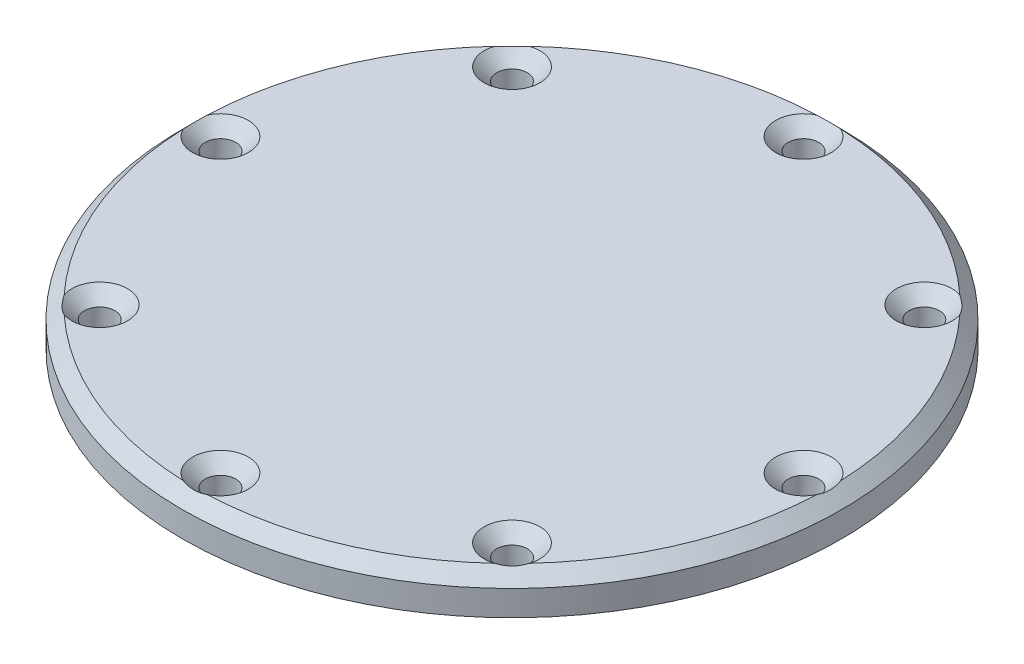
ISO-10303-21;
HEADER;
FILE_DESCRIPTION(('STEP AP214'),'2;1');
FILE_NAME('part.step','',(''),(''),'','','');
FILE_SCHEMA(('AUTOMOTIVE_DESIGN { 1 0 10303 214 1 1 1 1 }'));
ENDSEC;
DATA;
#1=APPLICATION_CONTEXT('core data for automotive mechanical design processes');
#2=APPLICATION_PROTOCOL_DEFINITION('international standard','automotive_design',2000,#1);
#3=PRODUCT_CONTEXT('',#1,'mechanical');
#4=PRODUCT('Part','Part','',(#3));
#5=PRODUCT_RELATED_PRODUCT_CATEGORY('part','',(#4));
#6=PRODUCT_DEFINITION_FORMATION('','',#4);
#7=PRODUCT_DEFINITION_CONTEXT('part definition',#1,'design');
#8=PRODUCT_DEFINITION('design','',#6,#7);
#9=PRODUCT_DEFINITION_SHAPE('','',#8);
#10=(LENGTH_UNIT() NAMED_UNIT(*) SI_UNIT(.MILLI.,.METRE.));
#11=(NAMED_UNIT(*) PLANE_ANGLE_UNIT() SI_UNIT($,.RADIAN.));
#12=(NAMED_UNIT(*) SI_UNIT($,.STERADIAN.) SOLID_ANGLE_UNIT());
#13=UNCERTAINTY_MEASURE_WITH_UNIT(LENGTH_MEASURE(1.E-05),#10,'distance_accuracy_value','');
#14=(GEOMETRIC_REPRESENTATION_CONTEXT(3) GLOBAL_UNCERTAINTY_ASSIGNED_CONTEXT((#13)) GLOBAL_UNIT_ASSIGNED_CONTEXT((#10,
#11,#12)) REPRESENTATION_CONTEXT('',''));
#15=CARTESIAN_POINT('',(0.,0.,0.));
#16=DIRECTION('',(0.,0.,1.));
#17=DIRECTION('',(1.,0.,0.));
#18=AXIS2_PLACEMENT_3D('',#15,#16,#17);
#19=CARTESIAN_POINT('',(0.,0.,0.));
#20=DIRECTION('',(0.,-1.,0.));
#21=DIRECTION('',(0.,0.,-1.));
#22=AXIS2_PLACEMENT_3D('',#19,#20,#21);
#23=PLANE('',#22);
#24=CARTESIAN_POINT('',(0.,-4.25874613352306E-13,-23.));
#25=DIRECTION('',(0.,1.,0.));
#26=DIRECTION('',(0.707106781186549,0.,0.707106781186546));
#27=AXIS2_PLACEMENT_3D('',#24,#25,#26);
#28=CIRCLE('',#27,1.19999999999999);
#29=CARTESIAN_POINT('',(0.848528137423843,-4.25874613352306E-13,-22.1514718625762));
#30=VERTEX_POINT('',#29);
#31=EDGE_CURVE('E108',#30,#30,#28,.T.);
#32=ORIENTED_EDGE('',*,*,#31,.T.);
#33=EDGE_LOOP('',(#32));
#34=FACE_BOUND('',#33,.T.);
#35=CARTESIAN_POINT('',(-16.2634559672906,-4.25874613352306E-13,-16.2634559672906));
#36=DIRECTION('',(0.,1.,0.));
#37=DIRECTION('',(1.,0.,0.));
#38=AXIS2_PLACEMENT_3D('',#35,#36,#37);
#39=CIRCLE('',#38,1.19999999999999);
#40=CARTESIAN_POINT('',(-15.0634559672906,-4.25874613352306E-13,-16.2634559672906));
#41=VERTEX_POINT('',#40);
#42=EDGE_CURVE('E156',#41,#41,#39,.T.);
#43=ORIENTED_EDGE('',*,*,#42,.T.);
#44=EDGE_LOOP('',(#43));
#45=FACE_BOUND('',#44,.T.);
#46=CARTESIAN_POINT('',(-23.,-4.25874613352306E-13,0.));
#47=DIRECTION('',(0.,1.,0.));
#48=DIRECTION('',(0.707106781186544,0.,-0.707106781186551));
#49=AXIS2_PLACEMENT_3D('',#46,#47,#48);
#50=CIRCLE('',#49,1.19999999999999);
#51=CARTESIAN_POINT('',(-22.1514718625762,-4.25874613352306E-13,-0.848528137423765));
#52=VERTEX_POINT('',#51);
#53=EDGE_CURVE('E170',#52,#52,#50,.T.);
#54=ORIENTED_EDGE('',*,*,#53,.T.);
#55=EDGE_LOOP('',(#54));
#56=FACE_BOUND('',#55,.T.);
#57=CARTESIAN_POINT('',(-16.2634559672906,-4.25874613352306E-13,16.2634559672906));
#58=DIRECTION('',(0.,1.,0.));
#59=DIRECTION('',(0.,0.,-1.));
#60=AXIS2_PLACEMENT_3D('',#57,#58,#59);
#61=CIRCLE('',#60,1.19999999999999);
#62=CARTESIAN_POINT('',(-16.2634559672906,-4.25874613352306E-13,15.0634559672906));
#63=VERTEX_POINT('',#62);
#64=EDGE_CURVE('E212',#63,#63,#61,.T.);
#65=ORIENTED_EDGE('',*,*,#64,.T.);
#66=EDGE_LOOP('',(#65));
#67=FACE_BOUND('',#66,.T.);
#68=CARTESIAN_POINT('',(1.66533453693773E-13,-4.25874613352306E-13,23.));
#69=DIRECTION('',(0.,1.,0.));
#70=DIRECTION('',(-0.707106781186554,0.,-0.707106781186541));
#71=AXIS2_PLACEMENT_3D('',#68,#69,#70);
#72=CIRCLE('',#71,1.19999999999999);
#73=CARTESIAN_POINT('',(-0.848528137423688,-4.25874613352306E-13,22.1514718625762));
#74=VERTEX_POINT('',#73);
#75=EDGE_CURVE('E216',#74,#74,#72,.T.);
#76=ORIENTED_EDGE('',*,*,#75,.T.);
#77=EDGE_LOOP('',(#76));
#78=FACE_BOUND('',#77,.T.);
#79=CARTESIAN_POINT('',(16.2634559672907,-4.25874613352306E-13,16.2634559672904));
#80=DIRECTION('',(0.,1.,0.));
#81=DIRECTION('',(-1.,0.,0.));
#82=AXIS2_PLACEMENT_3D('',#79,#80,#81);
#83=CIRCLE('',#82,1.19999999999999);
#84=CARTESIAN_POINT('',(15.0634559672907,-4.25874613352306E-13,16.2634559672905));
#85=VERTEX_POINT('',#84);
#86=EDGE_CURVE('E220',#85,#85,#83,.T.);
#87=ORIENTED_EDGE('',*,*,#86,.T.);
#88=EDGE_LOOP('',(#87));
#89=FACE_BOUND('',#88,.T.);
#90=CARTESIAN_POINT('',(23.,-4.25874613352306E-13,-2.46330733588707E-13));
#91=DIRECTION('',(0.,1.,0.));
#92=DIRECTION('',(-0.707106781186539,0.,0.707106781186556));
#93=AXIS2_PLACEMENT_3D('',#90,#91,#92);
#94=CIRCLE('',#93,1.19999999999999);
#95=CARTESIAN_POINT('',(22.1514718625762,-4.25874613352306E-13,0.848528137423611));
#96=VERTEX_POINT('',#95);
#97=EDGE_CURVE('E224',#96,#96,#94,.T.);
#98=ORIENTED_EDGE('',*,*,#97,.T.);
#99=EDGE_LOOP('',(#98));
#100=FACE_BOUND('',#99,.T.);
#101=CARTESIAN_POINT('',(16.2634559672906,-4.25874613352306E-13,-16.2634559672906));
#102=DIRECTION('',(0.,1.,0.));
#103=DIRECTION('',(0.,0.,1.));
#104=AXIS2_PLACEMENT_3D('',#101,#102,#103);
#105=CIRCLE('',#104,1.19999999999999);
#106=CARTESIAN_POINT('',(16.2634559672906,-4.25874613352306E-13,-15.0634559672906));
#107=VERTEX_POINT('',#106);
#108=EDGE_CURVE('E122',#107,#107,#105,.T.);
#109=ORIENTED_EDGE('',*,*,#108,.T.);
#110=EDGE_LOOP('',(#109));
#111=FACE_BOUND('',#110,.T.);
#112=CARTESIAN_POINT('',(0.,0.,0.));
#113=DIRECTION('',(0.,-1.,0.));
#114=DIRECTION('',(0.,0.,-1.));
#115=AXIS2_PLACEMENT_3D('',#112,#113,#114);
#116=CIRCLE('',#115,26.);
#117=CARTESIAN_POINT('',(0.,0.,-26.));
#118=VERTEX_POINT('',#117);
#119=EDGE_CURVE('E46',#118,#118,#116,.T.);
#120=ORIENTED_EDGE('',*,*,#119,.T.);
#121=EDGE_LOOP('',(#120));
#122=FACE_BOUND('',#121,.T.);
#123=ADVANCED_FACE('F34',(#34,#45,#56,#67,#78,#89,#100,#111,#122),#23,.T.);
#124=CARTESIAN_POINT('',(0.,0.,0.));
#125=DIRECTION('',(0.,-1.,0.));
#126=DIRECTION('',(0.,0.,-1.));
#127=AXIS2_PLACEMENT_3D('',#124,#125,#126);
#128=CYLINDRICAL_SURFACE('',#127,26.);
#129=CARTESIAN_POINT('',(0.,2.,0.));
#130=DIRECTION('',(0.,-1.,0.));
#131=DIRECTION('',(0.,0.,-1.));
#132=AXIS2_PLACEMENT_3D('',#129,#130,#131);
#133=CIRCLE('',#132,26.);
#134=CARTESIAN_POINT('',(0.,2.,-26.));
#135=VERTEX_POINT('',#134);
#136=EDGE_CURVE('E131',#135,#135,#133,.T.);
#137=ORIENTED_EDGE('',*,*,#136,.T.);
#138=EDGE_LOOP('',(#137));
#139=FACE_BOUND('',#138,.T.);
#140=ORIENTED_EDGE('',*,*,#119,.F.);
#141=EDGE_LOOP('',(#140));
#142=FACE_BOUND('',#141,.T.);
#143=ADVANCED_FACE('F196',(#139,#142),#128,.T.);
#144=CARTESIAN_POINT('',(0.,2.,0.));
#145=DIRECTION('',(0.,-1.,0.));
#146=DIRECTION('',(0.,0.,-1.));
#147=AXIS2_PLACEMENT_3D('',#144,#145,#146);
#148=CONICAL_SURFACE('',#147,26.,0.785398163397447);
#149=CARTESIAN_POINT('',(0.956309286648669,3.00019999999958,-24.9815026086961));
#150=CARTESIAN_POINT('',(0.87103099326336,2.98223050739615,-25.0027534869278));
#151=CARTESIAN_POINT('',(0.784586897043976,2.96649907890229,-25.0213576110847));
#152=CARTESIAN_POINT('',(0.609894930945489,2.93981124019831,-25.0529188812349));
#153=CARTESIAN_POINT('',(0.521645945818552,2.92885788179651,-25.0658724181331));
#154=CARTESIAN_POINT('',(0.346418157432572,2.91227924219472,-25.0854784614556));
#155=CARTESIAN_POINT('',(0.259470879918621,2.90651609574551,-25.0922940085237));
#156=CARTESIAN_POINT('',(0.085161055164271,2.89996303913165,-25.1000437102313));
#157=CARTESIAN_POINT('',(-0.00220128685794571,2.89917088473064,-25.1009805189243));
#158=CARTESIAN_POINT('',(-0.162175447605604,2.90229155461146,-25.0972899875923));
#159=CARTESIAN_POINT('',(-0.234825470343622,2.90544423923967,-25.0935615953339));
#160=CARTESIAN_POINT('',(-0.379578625365488,2.91515482823399,-25.0820777683496));
#161=CARTESIAN_POINT('',(-0.45168175624664,2.92171274133103,-25.0743223232985));
#162=CARTESIAN_POINT('',(-0.596669220070628,2.93831116439749,-25.0546928838503));
#163=CARTESIAN_POINT('',(-0.66953185742234,2.94843017895848,-25.0427260492405));
#164=CARTESIAN_POINT('',(-0.813963079091291,2.97192221420962,-25.014944164073));
#165=CARTESIAN_POINT('',(-0.885532109500487,2.98529408925064,-24.99913046837));
#166=CARTESIAN_POINT('',(-0.956309286648681,3.00019999999958,-24.9815026086961));
#167=B_SPLINE_CURVE_WITH_KNOTS('',3,(#149,#150,#151,#152,#153,#154,#155,#156,#157,#158,#159,
#160,#161,#162,#163,#164,#165,#166),.UNSPECIFIED.,.F.,.F.,(4,2,2,2,2,2,2,2,4),(0.,
0.269090275247971,0.538352170789932,0.800230636032514,1.06199086341166,1.28024339197641,
1.49849648013749,1.72189812645513,1.9452212049131),.UNSPECIFIED.);
#168=CARTESIAN_POINT('',(0.955358581321902,3.,-24.9817391304348));
#169=VERTEX_POINT('',#168);
#170=CARTESIAN_POINT('',(-0.955358581320986,2.99999999999954,-24.9817391304348));
#171=VERTEX_POINT('',#170);
#172=EDGE_CURVE('E52',#169,#171,#167,.T.);
#173=ORIENTED_EDGE('',*,*,#172,.F.);
#174=CARTESIAN_POINT('',(0.,3.,0.));
#175=DIRECTION('',(0.,-1.,0.));
#176=DIRECTION('',(0.,0.,-1.));
#177=AXIS2_PLACEMENT_3D('',#174,#175,#176);
#178=CIRCLE('',#177,25.);
#179=CARTESIAN_POINT('',(16.989216613648,2.99999999999958,-18.3402976762802));
#180=VERTEX_POINT('',#179);
#181=EDGE_CURVE('E114',#169,#180,#178,.T.);
#182=ORIENTED_EDGE('',*,*,#181,.T.);
#183=CARTESIAN_POINT('',(18.3408026803394,3.00019999999958,-16.9883771173375));
#184=CARTESIAN_POINT('',(18.2955284609024,2.98223050739615,-17.063704616982));
#185=CARTESIAN_POINT('',(18.2475583566216,2.96649907890229,-17.1379849259617));
#186=CARTESIAN_POINT('',(18.1463496709206,2.93981124019832,-17.2838279879548));
#187=CARTESIAN_POINT('',(18.0931077488856,2.92885788179651,-17.355388977552));
#188=CARTESIAN_POINT('',(17.9830665576511,2.91227924219472,-17.4931573011576));
#189=CARTESIAN_POINT('',(17.9264048676646,2.90651609574551,-17.5594576302427));
#190=CARTESIAN_POINT('',(17.808629075183,2.89996303913165,-17.6881931559836));
#191=CARTESIAN_POINT('',(17.7475169944982,2.89917088473064,-17.7506300842273));
#192=CARTESIAN_POINT('',(17.6317885808879,2.90229155461146,-17.8611392983756));
#193=CARTESIAN_POINT('',(17.5777808857076,2.90544423923967,-17.9098742506582));
#194=CARTESIAN_POINT('',(17.467304656259,2.915154828234,-18.0041098962377));
#195=CARTESIAN_POINT('',(17.4108361156814,2.92171274133103,-18.0496105812418));
#196=CARTESIAN_POINT('',(17.2944343870797,2.93831116439749,-18.1382520903541));
#197=CARTESIAN_POINT('',(17.2344508922112,2.94843017895848,-18.1813119254187));
#198=CARTESIAN_POINT('',(17.112677836558,2.97192221420962,-18.2637954622798));
#199=CARTESIAN_POINT('',(17.0508889183654,2.98529408925064,-18.3032204375378));
#200=CARTESIAN_POINT('',(16.9883771173375,3.00019999999958,-18.3408026803394));
#201=B_SPLINE_CURVE_WITH_KNOTS('',3,(#183,#184,#185,#186,#187,#188,#189,#190,#191,#192,#193,
#194,#195,#196,#197,#198,#199,#200),.UNSPECIFIED.,.F.,.F.,(4,2,2,2,2,2,2,2,4),(0.,
0.26909027524797,0.538352170789932,0.800230636032514,1.06199086341165,1.28024339197641,
1.49849648013749,1.72189812645513,1.9452212049131),.UNSPECIFIED.);
#202=CARTESIAN_POINT('',(18.3402976762812,3.,-16.9892166136462));
#203=VERTEX_POINT('',#202);
#204=EDGE_CURVE('E11',#203,#180,#201,.T.);
#205=ORIENTED_EDGE('',*,*,#204,.F.);
#206=CARTESIAN_POINT('',(24.9817391304348,2.99999999999954,-0.955358581321248));
#207=VERTEX_POINT('',#206);
#208=EDGE_CURVE('E124',#203,#207,#178,.T.);
#209=ORIENTED_EDGE('',*,*,#208,.T.);
#210=CARTESIAN_POINT('',(24.9815026086961,3.00019999999958,0.956309286648407));
#211=CARTESIAN_POINT('',(25.0027534869278,2.98223050739615,0.871030993263098));
#212=CARTESIAN_POINT('',(25.0213576110847,2.96649907890229,0.784586897043713));
#213=CARTESIAN_POINT('',(25.0529188812349,2.93981124019831,0.609894930945227));
#214=CARTESIAN_POINT('',(25.0658724181331,2.92885788179651,0.521645945818289));
#215=CARTESIAN_POINT('',(25.0854784614556,2.91227924219472,0.346418157432309));
#216=CARTESIAN_POINT('',(25.0922940085237,2.90651609574551,0.259470879918358));
#217=CARTESIAN_POINT('',(25.1000437102313,2.89996303913164,0.0851610551640076));
#218=CARTESIAN_POINT('',(25.1009805189243,2.89917088473064,-0.00220128685820928));
#219=CARTESIAN_POINT('',(25.0972899875923,2.90229155461147,-0.162175447605867));
#220=CARTESIAN_POINT('',(25.0935615953339,2.90544423923967,-0.234825470343885));
#221=CARTESIAN_POINT('',(25.0820777683496,2.915154828234,-0.379578625365751));
#222=CARTESIAN_POINT('',(25.0743223232985,2.92171274133103,-0.451681756246903));
#223=CARTESIAN_POINT('',(25.0546928838503,2.93831116439749,-0.59666922007089));
#224=CARTESIAN_POINT('',(25.0427260492405,2.94843017895848,-0.669531857422603));
#225=CARTESIAN_POINT('',(25.014944164073,2.97192221420962,-0.813963079091553));
#226=CARTESIAN_POINT('',(24.9991304683699,2.98529408925064,-0.885532109500748));
#227=CARTESIAN_POINT('',(24.9815026086961,3.00019999999958,-0.956309286648941));
#228=B_SPLINE_CURVE_WITH_KNOTS('',3,(#210,#211,#212,#213,#214,#215,#216,#217,#218,#219,#220,
#221,#222,#223,#224,#225,#226,#227),.UNSPECIFIED.,.F.,.F.,(4,2,2,2,2,2,2,2,4),(0.,
0.269090275247972,0.538352170789932,0.800230636032514,1.06199086341166,1.28024339197641,
1.49849648013749,1.72189812645513,1.9452212049131),.UNSPECIFIED.);
#229=CARTESIAN_POINT('',(24.9817391304348,3.,0.95535858132164));
#230=VERTEX_POINT('',#229);
#231=EDGE_CURVE('E249',#230,#207,#228,.T.);
#232=ORIENTED_EDGE('',*,*,#231,.F.);
#233=CARTESIAN_POINT('',(18.3402976762807,2.99999999999954,16.9892166136468));
#234=VERTEX_POINT('',#233);
#235=EDGE_CURVE('E132',#230,#234,#178,.T.);
#236=ORIENTED_EDGE('',*,*,#235,.T.);
#237=CARTESIAN_POINT('',(16.9883771173377,3.00019999999958,18.3408026803392));
#238=CARTESIAN_POINT('',(17.0637046169822,2.98223050739615,18.2955284609022));
#239=CARTESIAN_POINT('',(17.1379849259619,2.96649907890229,18.2475583566214));
#240=CARTESIAN_POINT('',(17.283827987955,2.93981124019831,18.1463496709204));
#241=CARTESIAN_POINT('',(17.3553889775521,2.92885788179651,18.0931077488854));
#242=CARTESIAN_POINT('',(17.4931573011578,2.91227924219472,17.9830665576509));
#243=CARTESIAN_POINT('',(17.5594576302429,2.90651609574551,17.9264048676644));
#244=CARTESIAN_POINT('',(17.6881931559838,2.89996303913165,17.8086290751828));
#245=CARTESIAN_POINT('',(17.7506300842275,2.89917088473064,17.747516994498));
#246=CARTESIAN_POINT('',(17.8611392983758,2.90229155461146,17.6317885808877));
#247=CARTESIAN_POINT('',(17.9098742506584,2.90544423923967,17.5777808857075));
#248=CARTESIAN_POINT('',(18.0041098962379,2.915154828234,17.4673046562588));
#249=CARTESIAN_POINT('',(18.049610581242,2.92171274133103,17.4108361156812));
#250=CARTESIAN_POINT('',(18.1382520903543,2.93831116439749,17.2944343870795));
#251=CARTESIAN_POINT('',(18.1813119254189,2.94843017895848,17.234450892211));
#252=CARTESIAN_POINT('',(18.26379546228,2.97192221420962,17.1126778365578));
#253=CARTESIAN_POINT('',(18.303220437538,2.98529408925064,17.0508889183652));
#254=CARTESIAN_POINT('',(18.3408026803396,3.00019999999958,16.9883771173373));
#255=B_SPLINE_CURVE_WITH_KNOTS('',3,(#237,#238,#239,#240,#241,#242,#243,#244,#245,#246,#247,
#248,#249,#250,#251,#252,#253,#254),.UNSPECIFIED.,.F.,.F.,(4,2,2,2,2,2,2,2,4),(0.,
0.26909027524797,0.538352170789931,0.800230636032515,1.06199086341166,1.28024339197641,
1.4984964801375,1.72189812645513,1.9452212049131),.UNSPECIFIED.);
#256=CARTESIAN_POINT('',(16.9892166136464,3.,18.3402976762811));
#257=VERTEX_POINT('',#256);
#258=EDGE_CURVE('E245',#257,#234,#255,.T.);
#259=ORIENTED_EDGE('',*,*,#258,.F.);
#260=CARTESIAN_POINT('',(0.955358581321162,2.99999999999954,24.9817391304348));
#261=VERTEX_POINT('',#260);
#262=EDGE_CURVE('E136',#257,#261,#178,.T.);
#263=ORIENTED_EDGE('',*,*,#262,.T.);
#264=CARTESIAN_POINT('',(-0.956309286648494,3.00019999999958,24.9815026086961));
#265=CARTESIAN_POINT('',(-0.871030993263185,2.98223050739615,25.0027534869278));
#266=CARTESIAN_POINT('',(-0.7845868970438,2.96649907890229,25.0213576110847));
#267=CARTESIAN_POINT('',(-0.609894930945313,2.93981124019831,25.0529188812349));
#268=CARTESIAN_POINT('',(-0.521645945818376,2.92885788179651,25.0658724181331));
#269=CARTESIAN_POINT('',(-0.346418157432396,2.91227924219472,25.0854784614556));
#270=CARTESIAN_POINT('',(-0.259470879918445,2.90651609574551,25.0922940085237));
#271=CARTESIAN_POINT('',(-0.0851610551640943,2.89996303913165,25.1000437102313));
#272=CARTESIAN_POINT('',(0.00220128685812254,2.89917088473064,25.1009805189243));
#273=CARTESIAN_POINT('',(0.162175447605781,2.90229155461146,25.0972899875923));
#274=CARTESIAN_POINT('',(0.234825470343798,2.90544423923967,25.0935615953339));
#275=CARTESIAN_POINT('',(0.379578625365665,2.91515482823399,25.0820777683496));
#276=CARTESIAN_POINT('',(0.451681756246816,2.92171274133103,25.0743223232985));
#277=CARTESIAN_POINT('',(0.596669220070803,2.93831116439749,25.0546928838503));
#278=CARTESIAN_POINT('',(0.669531857422516,2.94843017895848,25.0427260492405));
#279=CARTESIAN_POINT('',(0.813963079091466,2.97192221420962,25.014944164073));
#280=CARTESIAN_POINT('',(0.885532109500661,2.98529408925064,24.9991304683699));
#281=CARTESIAN_POINT('',(0.956309286648855,3.00019999999958,24.9815026086961));
#282=B_SPLINE_CURVE_WITH_KNOTS('',3,(#264,#265,#266,#267,#268,#269,#270,#271,#272,#273,#274,
#275,#276,#277,#278,#279,#280,#281),.UNSPECIFIED.,.F.,.F.,(4,2,2,2,2,2,2,2,4),(0.,
0.269090275247972,0.538352170789933,0.800230636032515,1.06199086341166,1.28024339197641,
1.49849648013749,1.72189812645513,1.9452212049131),.UNSPECIFIED.);
#283=CARTESIAN_POINT('',(-0.955358581321727,3.,24.9817391304348));
#284=VERTEX_POINT('',#283);
#285=EDGE_CURVE('E451',#284,#261,#282,.T.);
#286=ORIENTED_EDGE('',*,*,#285,.F.);
#287=CARTESIAN_POINT('',(-16.989216613647,2.99999999999954,18.3402976762806));
#288=VERTEX_POINT('',#287);
#289=EDGE_CURVE('E140',#284,#288,#178,.T.);
#290=ORIENTED_EDGE('',*,*,#289,.T.);
#291=CARTESIAN_POINT('',(-18.3408026803394,3.00019999999958,16.9883771173375));
#292=CARTESIAN_POINT('',(-18.2955284609024,2.98223050739615,17.063704616982));
#293=CARTESIAN_POINT('',(-18.2475583566216,2.96649907890229,17.1379849259617));
#294=CARTESIAN_POINT('',(-18.1463496709206,2.93981124019832,17.2838279879548));
#295=CARTESIAN_POINT('',(-18.0931077488856,2.92885788179651,17.355388977552));
#296=CARTESIAN_POINT('',(-17.9830665576511,2.91227924219472,17.4931573011576));
#297=CARTESIAN_POINT('',(-17.9264048676646,2.90651609574551,17.5594576302427));
#298=CARTESIAN_POINT('',(-17.808629075183,2.89996303913165,17.6881931559836));
#299=CARTESIAN_POINT('',(-17.7475169944982,2.89917088473064,17.7506300842273));
#300=CARTESIAN_POINT('',(-17.6317885808879,2.90229155461146,17.8611392983756));
#301=CARTESIAN_POINT('',(-17.5777808857076,2.90544423923967,17.9098742506582));
#302=CARTESIAN_POINT('',(-17.467304656259,2.915154828234,18.0041098962377));
#303=CARTESIAN_POINT('',(-17.4108361156814,2.92171274133103,18.0496105812418));
#304=CARTESIAN_POINT('',(-17.2944343870797,2.93831116439749,18.1382520903541));
#305=CARTESIAN_POINT('',(-17.2344508922112,2.94843017895848,18.1813119254187));
#306=CARTESIAN_POINT('',(-17.112677836558,2.97192221420962,18.2637954622798));
#307=CARTESIAN_POINT('',(-17.0508889183654,2.98529408925064,18.3032204375378));
#308=CARTESIAN_POINT('',(-16.9883771173375,3.00019999999958,18.3408026803394));
#309=B_SPLINE_CURVE_WITH_KNOTS('',3,(#291,#292,#293,#294,#295,#296,#297,#298,#299,#300,#301,
#302,#303,#304,#305,#306,#307,#308),.UNSPECIFIED.,.F.,.F.,(4,2,2,2,2,2,2,2,4),(0.,
0.26909027524797,0.538352170789932,0.800230636032514,1.06199086341165,1.28024339197641,
1.49849648013749,1.72189812645513,1.9452212049131),.UNSPECIFIED.);
#310=CARTESIAN_POINT('',(-18.3402976762812,3.,16.9892166136462));
#311=VERTEX_POINT('',#310);
#312=EDGE_CURVE('E438',#311,#288,#309,.T.);
#313=ORIENTED_EDGE('',*,*,#312,.F.);
#314=CARTESIAN_POINT('',(-24.9817391304348,2.99999999999954,0.955358581321075));
#315=VERTEX_POINT('',#314);
#316=EDGE_CURVE('E144',#311,#315,#178,.T.);
#317=ORIENTED_EDGE('',*,*,#316,.T.);
#318=CARTESIAN_POINT('',(-24.9815026086961,3.00019999999958,-0.956309286648581));
#319=CARTESIAN_POINT('',(-25.0027534869278,2.98223050739615,-0.871030993263272));
#320=CARTESIAN_POINT('',(-25.0213576110847,2.96649907890229,-0.784586897043887));
#321=CARTESIAN_POINT('',(-25.0529188812349,2.93981124019832,-0.6098949309454));
#322=CARTESIAN_POINT('',(-25.0658724181331,2.92885788179651,-0.521645945818462));
#323=CARTESIAN_POINT('',(-25.0854784614556,2.91227924219472,-0.346418157432482));
#324=CARTESIAN_POINT('',(-25.0922940085237,2.90651609574551,-0.259470879918531));
#325=CARTESIAN_POINT('',(-25.1000437102313,2.89996303913165,-0.0851610551641808));
#326=CARTESIAN_POINT('',(-25.1009805189243,2.89917088473064,0.00220128685803598));
#327=CARTESIAN_POINT('',(-25.0972899875923,2.90229155461146,0.162175447605694));
#328=CARTESIAN_POINT('',(-25.0935615953339,2.90544423923967,0.234825470343711));
#329=CARTESIAN_POINT('',(-25.0820777683496,2.915154828234,0.379578625365578));
#330=CARTESIAN_POINT('',(-25.0743223232985,2.92171274133103,0.451681756246729));
#331=CARTESIAN_POINT('',(-25.0546928838503,2.93831116439749,0.596669220070717));
#332=CARTESIAN_POINT('',(-25.0427260492405,2.94843017895849,0.66953185742243));
#333=CARTESIAN_POINT('',(-25.014944164073,2.97192221420962,0.813963079091381));
#334=CARTESIAN_POINT('',(-24.9991304683699,2.98529408925064,0.885532109500576));
#335=CARTESIAN_POINT('',(-24.9815026086961,3.00019999999958,0.95630928664877));
#336=B_SPLINE_CURVE_WITH_KNOTS('',3,(#318,#319,#320,#321,#322,#323,#324,#325,#326,#327,#328,
#329,#330,#331,#332,#333,#334,#335),.UNSPECIFIED.,.F.,.F.,(4,2,2,2,2,2,2,2,4),(0.,
0.269090275247972,0.538352170789933,0.800230636032515,1.06199086341166,1.28024339197641,
1.49849648013749,1.72189812645513,1.9452212049131),.UNSPECIFIED.);
#337=CARTESIAN_POINT('',(-24.9817391304348,3.,-0.955358581321814));
#338=VERTEX_POINT('',#337);
#339=EDGE_CURVE('E152',#338,#315,#336,.T.);
#340=ORIENTED_EDGE('',*,*,#339,.F.);
#341=CARTESIAN_POINT('',(-18.3402976762806,2.99999999999954,-16.9892166136469));
#342=VERTEX_POINT('',#341);
#343=EDGE_CURVE('E125',#338,#342,#178,.T.);
#344=ORIENTED_EDGE('',*,*,#343,.T.);
#345=CARTESIAN_POINT('',(-16.9883771173375,3.00019999999958,-18.3408026803394));
#346=CARTESIAN_POINT('',(-17.0637046169821,2.98223050739615,-18.2955284609024));
#347=CARTESIAN_POINT('',(-17.1379849259617,2.96649907890229,-18.2475583566215));
#348=CARTESIAN_POINT('',(-17.2838279879549,2.93981124019831,-18.1463496709205));
#349=CARTESIAN_POINT('',(-17.355388977552,2.92885788179651,-18.0931077488855));
#350=CARTESIAN_POINT('',(-17.4931573011577,2.91227924219472,-17.983066557651));
#351=CARTESIAN_POINT('',(-17.5594576302428,2.90651609574551,-17.9264048676645));
#352=CARTESIAN_POINT('',(-17.6881931559837,2.89996303913165,-17.8086290751829));
#353=CARTESIAN_POINT('',(-17.7506300842274,2.89917088473064,-17.7475169944982));
#354=CARTESIAN_POINT('',(-17.8611392983757,2.90229155461146,-17.6317885808879));
#355=CARTESIAN_POINT('',(-17.9098742506582,2.90544423923967,-17.5777808857076));
#356=CARTESIAN_POINT('',(-18.0041098962378,2.915154828234,-17.4673046562589));
#357=CARTESIAN_POINT('',(-18.0496105812419,2.92171274133103,-17.4108361156813));
#358=CARTESIAN_POINT('',(-18.1382520903541,2.93831116439749,-17.2944343870796));
#359=CARTESIAN_POINT('',(-18.1813119254188,2.94843017895849,-17.2344508922112));
#360=CARTESIAN_POINT('',(-18.2637954622799,2.97192221420962,-17.1126778365579));
#361=CARTESIAN_POINT('',(-18.3032204375379,2.98529408925064,-17.0508889183654));
#362=CARTESIAN_POINT('',(-18.3408026803394,3.00019999999958,-16.9883771173375));
#363=B_SPLINE_CURVE_WITH_KNOTS('',3,(#345,#346,#347,#348,#349,#350,#351,#352,#353,#354,#355,
#356,#357,#358,#359,#360,#361,#362),.UNSPECIFIED.,.F.,.F.,(4,2,2,2,2,2,2,2,4),(0.,
0.269090275247973,0.538352170789935,0.800230636032516,1.06199086341166,1.28024339197641,
1.4984964801375,1.72189812645513,1.9452212049131),.UNSPECIFIED.);
#364=CARTESIAN_POINT('',(-16.9892166136463,3.,-18.3402976762812));
#365=VERTEX_POINT('',#364);
#366=EDGE_CURVE('E59',#365,#342,#363,.T.);
#367=ORIENTED_EDGE('',*,*,#366,.F.);
#368=EDGE_CURVE('E115',#365,#171,#178,.T.);
#369=ORIENTED_EDGE('',*,*,#368,.T.);
#370=EDGE_LOOP('',(#173,#182,#205,#209,#232,#236,#259,#263,#286,#290,#313,#317,#340,#344,#367,#369));
#371=FACE_BOUND('',#370,.T.);
#372=ORIENTED_EDGE('',*,*,#136,.F.);
#373=EDGE_LOOP('',(#372));
#374=FACE_BOUND('',#373,.T.);
#375=ADVANCED_FACE('F111',(#371,#374),#148,.T.);
#376=CARTESIAN_POINT('',(25.,2.99999999999958,0.));
#377=DIRECTION('',(0.,1.,0.));
#378=DIRECTION('',(0.,0.,1.));
#379=AXIS2_PLACEMENT_3D('',#376,#377,#378);
#380=PLANE('',#379);
#381=CARTESIAN_POINT('',(0.,2.99999999999958,-23.));
#382=DIRECTION('',(0.,1.,0.));
#383=DIRECTION('',(0.707106781186549,0.,0.707106781186546));
#384=AXIS2_PLACEMENT_3D('',#381,#382,#383);
#385=CIRCLE('',#384,2.2);
#386=EDGE_CURVE('E100',#171,#169,#385,.T.);
#387=ORIENTED_EDGE('',*,*,#386,.F.);
#388=ORIENTED_EDGE('',*,*,#368,.F.);
#389=CARTESIAN_POINT('',(-16.2634559672906,2.99999999999958,-16.2634559672906));
#390=DIRECTION('',(0.,1.,0.));
#391=DIRECTION('',(1.,0.,0.));
#392=AXIS2_PLACEMENT_3D('',#389,#390,#391);
#393=CIRCLE('',#392,2.2);
#394=EDGE_CURVE('E155',#342,#365,#393,.T.);
#395=ORIENTED_EDGE('',*,*,#394,.F.);
#396=ORIENTED_EDGE('',*,*,#343,.F.);
#397=CARTESIAN_POINT('',(-23.,2.99999999999958,0.));
#398=DIRECTION('',(0.,1.,0.));
#399=DIRECTION('',(0.707106781186544,0.,-0.707106781186551));
#400=AXIS2_PLACEMENT_3D('',#397,#398,#399);
#401=CIRCLE('',#400,2.2);
#402=EDGE_CURVE('E154',#315,#338,#401,.T.);
#403=ORIENTED_EDGE('',*,*,#402,.F.);
#404=ORIENTED_EDGE('',*,*,#316,.F.);
#405=CARTESIAN_POINT('',(-16.2634559672906,2.99999999999958,16.2634559672906));
#406=DIRECTION('',(0.,1.,0.));
#407=DIRECTION('',(0.,0.,-1.));
#408=AXIS2_PLACEMENT_3D('',#405,#406,#407);
#409=CIRCLE('',#408,2.2);
#410=EDGE_CURVE('E479',#288,#311,#409,.T.);
#411=ORIENTED_EDGE('',*,*,#410,.F.);
#412=ORIENTED_EDGE('',*,*,#289,.F.);
#413=CARTESIAN_POINT('',(1.66533453693773E-13,2.99999999999958,23.));
#414=DIRECTION('',(0.,1.,0.));
#415=DIRECTION('',(-0.707106781186554,0.,-0.707106781186541));
#416=AXIS2_PLACEMENT_3D('',#413,#414,#415);
#417=CIRCLE('',#416,2.2);
#418=EDGE_CURVE('E473',#261,#284,#417,.T.);
#419=ORIENTED_EDGE('',*,*,#418,.F.);
#420=ORIENTED_EDGE('',*,*,#262,.F.);
#421=CARTESIAN_POINT('',(16.2634559672907,2.99999999999958,16.2634559672904));
#422=DIRECTION('',(0.,1.,0.));
#423=DIRECTION('',(-1.,0.,0.));
#424=AXIS2_PLACEMENT_3D('',#421,#422,#423);
#425=CIRCLE('',#424,2.2);
#426=EDGE_CURVE('E466',#234,#257,#425,.T.);
#427=ORIENTED_EDGE('',*,*,#426,.F.);
#428=ORIENTED_EDGE('',*,*,#235,.F.);
#429=CARTESIAN_POINT('',(23.,2.99999999999958,-2.46330733588707E-13));
#430=DIRECTION('',(0.,1.,0.));
#431=DIRECTION('',(-0.707106781186539,0.,0.707106781186556));
#432=AXIS2_PLACEMENT_3D('',#429,#430,#431);
#433=CIRCLE('',#432,2.2);
#434=EDGE_CURVE('E246',#207,#230,#433,.T.);
#435=ORIENTED_EDGE('',*,*,#434,.F.);
#436=ORIENTED_EDGE('',*,*,#208,.F.);
#437=CARTESIAN_POINT('',(16.2634559672906,2.99999999999958,-16.2634559672906));
#438=DIRECTION('',(0.,1.,0.));
#439=DIRECTION('',(0.,0.,1.));
#440=AXIS2_PLACEMENT_3D('',#437,#438,#439);
#441=CIRCLE('',#440,2.2);
#442=EDGE_CURVE('E121',#180,#203,#441,.T.);
#443=ORIENTED_EDGE('',*,*,#442,.F.);
#444=ORIENTED_EDGE('',*,*,#181,.F.);
#445=EDGE_LOOP('',(#387,#388,#395,#396,#403,#404,#411,#412,#419,#420,#427,#428,#435,#436,#443,#444));
#446=FACE_BOUND('',#445,.T.);
#447=ADVANCED_FACE('F119',(#446),#380,.T.);
#448=CARTESIAN_POINT('',(16.2634559672906,2.99999999999958,-16.2634559672906));
#449=DIRECTION('',(0.,1.,0.));
#450=DIRECTION('',(0.,0.,1.));
#451=AXIS2_PLACEMENT_3D('',#448,#449,#450);
#452=CYLINDRICAL_SURFACE('',#451,1.19999999999999);
#453=ORIENTED_EDGE('',*,*,#108,.F.);
#454=EDGE_LOOP('',(#453));
#455=FACE_BOUND('',#454,.T.);
#456=CARTESIAN_POINT('',(16.2634559672906,1.99999999999958,-16.2634559672906));
#457=DIRECTION('',(0.,1.,0.));
#458=DIRECTION('',(0.,0.,1.));
#459=AXIS2_PLACEMENT_3D('',#456,#457,#458);
#460=CIRCLE('',#459,1.2);
#461=CARTESIAN_POINT('',(16.2634559672906,1.99999999999958,-15.0634559672906));
#462=VERTEX_POINT('',#461);
#463=EDGE_CURVE('E127',#462,#462,#460,.T.);
#464=ORIENTED_EDGE('',*,*,#463,.T.);
#465=EDGE_LOOP('',(#464));
#466=FACE_BOUND('',#465,.T.);
#467=ADVANCED_FACE('F231',(#455,#466),#452,.F.);
#468=CARTESIAN_POINT('',(16.2634559672906,2.99999999999958,-16.2634559672906));
#469=DIRECTION('',(0.,1.,0.));
#470=DIRECTION('',(0.,0.,1.));
#471=AXIS2_PLACEMENT_3D('',#468,#469,#470);
#472=CONICAL_SURFACE('',#471,2.2,0.785398163397448);
#473=ORIENTED_EDGE('',*,*,#204,.T.);
#474=ORIENTED_EDGE('',*,*,#442,.T.);
#475=EDGE_LOOP('',(#473,#474));
#476=FACE_BOUND('',#475,.T.);
#477=ORIENTED_EDGE('',*,*,#463,.F.);
#478=EDGE_LOOP('',(#477));
#479=FACE_BOUND('',#478,.T.);
#480=ADVANCED_FACE('F234',(#476,#479),#472,.F.);
#481=CARTESIAN_POINT('',(23.,2.99999999999958,-2.46330733588707E-13));
#482=DIRECTION('',(0.,1.,0.));
#483=DIRECTION('',(-0.707106781186539,0.,0.707106781186556));
#484=AXIS2_PLACEMENT_3D('',#481,#482,#483);
#485=CYLINDRICAL_SURFACE('',#484,1.19999999999999);
#486=ORIENTED_EDGE('',*,*,#97,.F.);
#487=EDGE_LOOP('',(#486));
#488=FACE_BOUND('',#487,.T.);
#489=CARTESIAN_POINT('',(23.,1.99999999999958,-2.46330733588707E-13));
#490=DIRECTION('',(0.,1.,0.));
#491=DIRECTION('',(-0.707106781186539,0.,0.707106781186556));
#492=AXIS2_PLACEMENT_3D('',#489,#490,#491);
#493=CIRCLE('',#492,1.2);
#494=CARTESIAN_POINT('',(22.1514718625762,1.99999999999958,0.848528137423621));
#495=VERTEX_POINT('',#494);
#496=EDGE_CURVE('E242',#495,#495,#493,.T.);
#497=ORIENTED_EDGE('',*,*,#496,.T.);
#498=EDGE_LOOP('',(#497));
#499=FACE_BOUND('',#498,.T.);
#500=ADVANCED_FACE('F265',(#488,#499),#485,.F.);
#501=CARTESIAN_POINT('',(23.,2.99999999999958,-2.46330733588707E-13));
#502=DIRECTION('',(0.,1.,0.));
#503=DIRECTION('',(-0.707106781186539,0.,0.707106781186556));
#504=AXIS2_PLACEMENT_3D('',#501,#502,#503);
#505=CONICAL_SURFACE('',#504,2.2,0.785398163397448);
#506=ORIENTED_EDGE('',*,*,#231,.T.);
#507=ORIENTED_EDGE('',*,*,#434,.T.);
#508=EDGE_LOOP('',(#506,#507));
#509=FACE_BOUND('',#508,.T.);
#510=ORIENTED_EDGE('',*,*,#496,.F.);
#511=EDGE_LOOP('',(#510));
#512=FACE_BOUND('',#511,.T.);
#513=ADVANCED_FACE('F260',(#509,#512),#505,.F.);
#514=CARTESIAN_POINT('',(16.2634559672907,2.99999999999958,16.2634559672904));
#515=DIRECTION('',(0.,1.,0.));
#516=DIRECTION('',(-1.,0.,0.));
#517=AXIS2_PLACEMENT_3D('',#514,#515,#516);
#518=CYLINDRICAL_SURFACE('',#517,1.19999999999999);
#519=ORIENTED_EDGE('',*,*,#86,.F.);
#520=EDGE_LOOP('',(#519));
#521=FACE_BOUND('',#520,.T.);
#522=CARTESIAN_POINT('',(16.2634559672907,1.99999999999958,16.2634559672904));
#523=DIRECTION('',(0.,1.,0.));
#524=DIRECTION('',(-1.,0.,0.));
#525=AXIS2_PLACEMENT_3D('',#522,#523,#524);
#526=CIRCLE('',#525,1.2);
#527=CARTESIAN_POINT('',(15.0634559672907,1.99999999999958,16.2634559672905));
#528=VERTEX_POINT('',#527);
#529=EDGE_CURVE('E256',#528,#528,#526,.T.);
#530=ORIENTED_EDGE('',*,*,#529,.T.);
#531=EDGE_LOOP('',(#530));
#532=FACE_BOUND('',#531,.T.);
#533=ADVANCED_FACE('F264',(#521,#532),#518,.F.);
#534=CARTESIAN_POINT('',(16.2634559672907,2.99999999999958,16.2634559672904));
#535=DIRECTION('',(0.,1.,0.));
#536=DIRECTION('',(-1.,0.,0.));
#537=AXIS2_PLACEMENT_3D('',#534,#535,#536);
#538=CONICAL_SURFACE('',#537,2.2,0.785398163397448);
#539=ORIENTED_EDGE('',*,*,#258,.T.);
#540=ORIENTED_EDGE('',*,*,#426,.T.);
#541=EDGE_LOOP('',(#539,#540));
#542=FACE_BOUND('',#541,.T.);
#543=ORIENTED_EDGE('',*,*,#529,.F.);
#544=EDGE_LOOP('',(#543));
#545=FACE_BOUND('',#544,.T.);
#546=ADVANCED_FACE('F332',(#542,#545),#538,.F.);
#547=CARTESIAN_POINT('',(1.66533453693773E-13,2.99999999999958,23.));
#548=DIRECTION('',(0.,1.,0.));
#549=DIRECTION('',(-0.707106781186554,0.,-0.707106781186541));
#550=AXIS2_PLACEMENT_3D('',#547,#548,#549);
#551=CYLINDRICAL_SURFACE('',#550,1.19999999999999);
#552=ORIENTED_EDGE('',*,*,#75,.F.);
#553=EDGE_LOOP('',(#552));
#554=FACE_BOUND('',#553,.T.);
#555=CARTESIAN_POINT('',(1.66533453693773E-13,1.99999999999958,23.));
#556=DIRECTION('',(0.,1.,0.));
#557=DIRECTION('',(-0.707106781186554,0.,-0.707106781186541));
#558=AXIS2_PLACEMENT_3D('',#555,#556,#557);
#559=CIRCLE('',#558,1.2);
#560=CARTESIAN_POINT('',(-0.848528137423698,1.99999999999958,22.1514718625762));
#561=VERTEX_POINT('',#560);
#562=EDGE_CURVE('E444',#561,#561,#559,.T.);
#563=ORIENTED_EDGE('',*,*,#562,.T.);
#564=EDGE_LOOP('',(#563));
#565=FACE_BOUND('',#564,.T.);
#566=ADVANCED_FACE('F340',(#554,#565),#551,.F.);
#567=CARTESIAN_POINT('',(1.66533453693773E-13,2.99999999999958,23.));
#568=DIRECTION('',(0.,1.,0.));
#569=DIRECTION('',(-0.707106781186554,0.,-0.707106781186541));
#570=AXIS2_PLACEMENT_3D('',#567,#568,#569);
#571=CONICAL_SURFACE('',#570,2.2,0.785398163397448);
#572=ORIENTED_EDGE('',*,*,#285,.T.);
#573=ORIENTED_EDGE('',*,*,#418,.T.);
#574=EDGE_LOOP('',(#572,#573));
#575=FACE_BOUND('',#574,.T.);
#576=ORIENTED_EDGE('',*,*,#562,.F.);
#577=EDGE_LOOP('',(#576));
#578=FACE_BOUND('',#577,.T.);
#579=ADVANCED_FACE('F349',(#575,#578),#571,.F.);
#580=CARTESIAN_POINT('',(-16.2634559672906,2.99999999999958,16.2634559672906));
#581=DIRECTION('',(0.,1.,0.));
#582=DIRECTION('',(0.,0.,-1.));
#583=AXIS2_PLACEMENT_3D('',#580,#581,#582);
#584=CYLINDRICAL_SURFACE('',#583,1.19999999999999);
#585=ORIENTED_EDGE('',*,*,#64,.F.);
#586=EDGE_LOOP('',(#585));
#587=FACE_BOUND('',#586,.T.);
#588=CARTESIAN_POINT('',(-16.2634559672906,1.99999999999958,16.2634559672906));
#589=DIRECTION('',(0.,1.,0.));
#590=DIRECTION('',(0.,0.,-1.));
#591=AXIS2_PLACEMENT_3D('',#588,#589,#590);
#592=CIRCLE('',#591,1.2);
#593=CARTESIAN_POINT('',(-16.2634559672906,1.99999999999958,15.0634559672906));
#594=VERTEX_POINT('',#593);
#595=EDGE_CURVE('E171',#594,#594,#592,.T.);
#596=ORIENTED_EDGE('',*,*,#595,.T.);
#597=EDGE_LOOP('',(#596));
#598=FACE_BOUND('',#597,.T.);
#599=ADVANCED_FACE('F191',(#587,#598),#584,.F.);
#600=CARTESIAN_POINT('',(-16.2634559672906,2.99999999999958,16.2634559672906));
#601=DIRECTION('',(0.,1.,0.));
#602=DIRECTION('',(0.,0.,-1.));
#603=AXIS2_PLACEMENT_3D('',#600,#601,#602);
#604=CONICAL_SURFACE('',#603,2.2,0.785398163397448);
#605=ORIENTED_EDGE('',*,*,#312,.T.);
#606=ORIENTED_EDGE('',*,*,#410,.T.);
#607=EDGE_LOOP('',(#605,#606));
#608=FACE_BOUND('',#607,.T.);
#609=ORIENTED_EDGE('',*,*,#595,.F.);
#610=EDGE_LOOP('',(#609));
#611=FACE_BOUND('',#610,.T.);
#612=ADVANCED_FACE('F186',(#608,#611),#604,.F.);
#613=CARTESIAN_POINT('',(-23.,2.99999999999958,0.));
#614=DIRECTION('',(0.,1.,0.));
#615=DIRECTION('',(0.707106781186544,0.,-0.707106781186551));
#616=AXIS2_PLACEMENT_3D('',#613,#614,#615);
#617=CYLINDRICAL_SURFACE('',#616,1.19999999999999);
#618=ORIENTED_EDGE('',*,*,#53,.F.);
#619=EDGE_LOOP('',(#618));
#620=FACE_BOUND('',#619,.T.);
#621=CARTESIAN_POINT('',(-23.,1.99999999999958,0.));
#622=DIRECTION('',(0.,1.,0.));
#623=DIRECTION('',(0.707106781186544,0.,-0.707106781186551));
#624=AXIS2_PLACEMENT_3D('',#621,#622,#623);
#625=CIRCLE('',#624,1.2);
#626=CARTESIAN_POINT('',(-22.1514718625761,1.99999999999958,-0.848528137423775));
#627=VERTEX_POINT('',#626);
#628=EDGE_CURVE('E430',#627,#627,#625,.T.);
#629=ORIENTED_EDGE('',*,*,#628,.T.);
#630=EDGE_LOOP('',(#629));
#631=FACE_BOUND('',#630,.T.);
#632=ADVANCED_FACE('F181',(#620,#631),#617,.F.);
#633=CARTESIAN_POINT('',(-23.,2.99999999999958,0.));
#634=DIRECTION('',(0.,1.,0.));
#635=DIRECTION('',(0.707106781186544,0.,-0.707106781186551));
#636=AXIS2_PLACEMENT_3D('',#633,#634,#635);
#637=CONICAL_SURFACE('',#636,2.2,0.785398163397448);
#638=ORIENTED_EDGE('',*,*,#339,.T.);
#639=ORIENTED_EDGE('',*,*,#402,.T.);
#640=EDGE_LOOP('',(#638,#639));
#641=FACE_BOUND('',#640,.T.);
#642=ORIENTED_EDGE('',*,*,#628,.F.);
#643=EDGE_LOOP('',(#642));
#644=FACE_BOUND('',#643,.T.);
#645=ADVANCED_FACE('F176',(#641,#644),#637,.F.);
#646=CARTESIAN_POINT('',(-16.2634559672906,2.99999999999958,-16.2634559672906));
#647=DIRECTION('',(0.,1.,0.));
#648=DIRECTION('',(1.,0.,0.));
#649=AXIS2_PLACEMENT_3D('',#646,#647,#648);
#650=CYLINDRICAL_SURFACE('',#649,1.19999999999999);
#651=ORIENTED_EDGE('',*,*,#42,.F.);
#652=EDGE_LOOP('',(#651));
#653=FACE_BOUND('',#652,.T.);
#654=CARTESIAN_POINT('',(-16.2634559672906,1.99999999999958,-16.2634559672906));
#655=DIRECTION('',(0.,1.,0.));
#656=DIRECTION('',(1.,0.,0.));
#657=AXIS2_PLACEMENT_3D('',#654,#655,#656);
#658=CIRCLE('',#657,1.2);
#659=CARTESIAN_POINT('',(-15.0634559672906,1.99999999999958,-16.2634559672906));
#660=VERTEX_POINT('',#659);
#661=EDGE_CURVE('E116',#660,#660,#658,.T.);
#662=ORIENTED_EDGE('',*,*,#661,.T.);
#663=EDGE_LOOP('',(#662));
#664=FACE_BOUND('',#663,.T.);
#665=ADVANCED_FACE('F180',(#653,#664),#650,.F.);
#666=CARTESIAN_POINT('',(-16.2634559672906,2.99999999999958,-16.2634559672906));
#667=DIRECTION('',(0.,1.,0.));
#668=DIRECTION('',(1.,0.,0.));
#669=AXIS2_PLACEMENT_3D('',#666,#667,#668);
#670=CONICAL_SURFACE('',#669,2.2,0.785398163397448);
#671=ORIENTED_EDGE('',*,*,#366,.T.);
#672=ORIENTED_EDGE('',*,*,#394,.T.);
#673=EDGE_LOOP('',(#671,#672));
#674=FACE_BOUND('',#673,.T.);
#675=ORIENTED_EDGE('',*,*,#661,.F.);
#676=EDGE_LOOP('',(#675));
#677=FACE_BOUND('',#676,.T.);
#678=ADVANCED_FACE('F388',(#674,#677),#670,.F.);
#679=CARTESIAN_POINT('',(0.,2.99999999999958,-23.));
#680=DIRECTION('',(0.,1.,0.));
#681=DIRECTION('',(0.707106781186549,0.,0.707106781186546));
#682=AXIS2_PLACEMENT_3D('',#679,#680,#681);
#683=CYLINDRICAL_SURFACE('',#682,1.19999999999999);
#684=ORIENTED_EDGE('',*,*,#31,.F.);
#685=EDGE_LOOP('',(#684));
#686=FACE_BOUND('',#685,.T.);
#687=CARTESIAN_POINT('',(0.,1.99999999999958,-23.));
#688=DIRECTION('',(0.,1.,0.));
#689=DIRECTION('',(0.707106781186549,0.,0.707106781186546));
#690=AXIS2_PLACEMENT_3D('',#687,#688,#689);
#691=CIRCLE('',#690,1.2);
#692=CARTESIAN_POINT('',(0.848528137423853,1.99999999999958,-22.1514718625761));
#693=VERTEX_POINT('',#692);
#694=EDGE_CURVE('E107',#693,#693,#691,.T.);
#695=ORIENTED_EDGE('',*,*,#694,.T.);
#696=EDGE_LOOP('',(#695));
#697=FACE_BOUND('',#696,.T.);
#698=ADVANCED_FACE('F396',(#686,#697),#683,.F.);
#699=CARTESIAN_POINT('',(0.,2.99999999999958,-23.));
#700=DIRECTION('',(0.,1.,0.));
#701=DIRECTION('',(0.707106781186549,0.,0.707106781186546));
#702=AXIS2_PLACEMENT_3D('',#699,#700,#701);
#703=CONICAL_SURFACE('',#702,2.2,0.785398163397448);
#704=ORIENTED_EDGE('',*,*,#172,.T.);
#705=ORIENTED_EDGE('',*,*,#386,.T.);
#706=EDGE_LOOP('',(#704,#705));
#707=FACE_BOUND('',#706,.T.);
#708=ORIENTED_EDGE('',*,*,#694,.F.);
#709=EDGE_LOOP('',(#708));
#710=FACE_BOUND('',#709,.T.);
#711=ADVANCED_FACE('F101',(#707,#710),#703,.F.);
#712=CLOSED_SHELL('',(#123,#143,#375,#447,#467,#480,#500,#513,#533,#546,#566,#579,#599,#612,
#632,#645,#665,#678,#698,#711));
#713=MANIFOLD_SOLID_BREP('B2',#712);
#714=ADVANCED_BREP_SHAPE_REPRESENTATION('',(#18,#713),#14);
#715=SHAPE_DEFINITION_REPRESENTATION(#9,#714);
ENDSEC;
END-ISO-10303-21;
